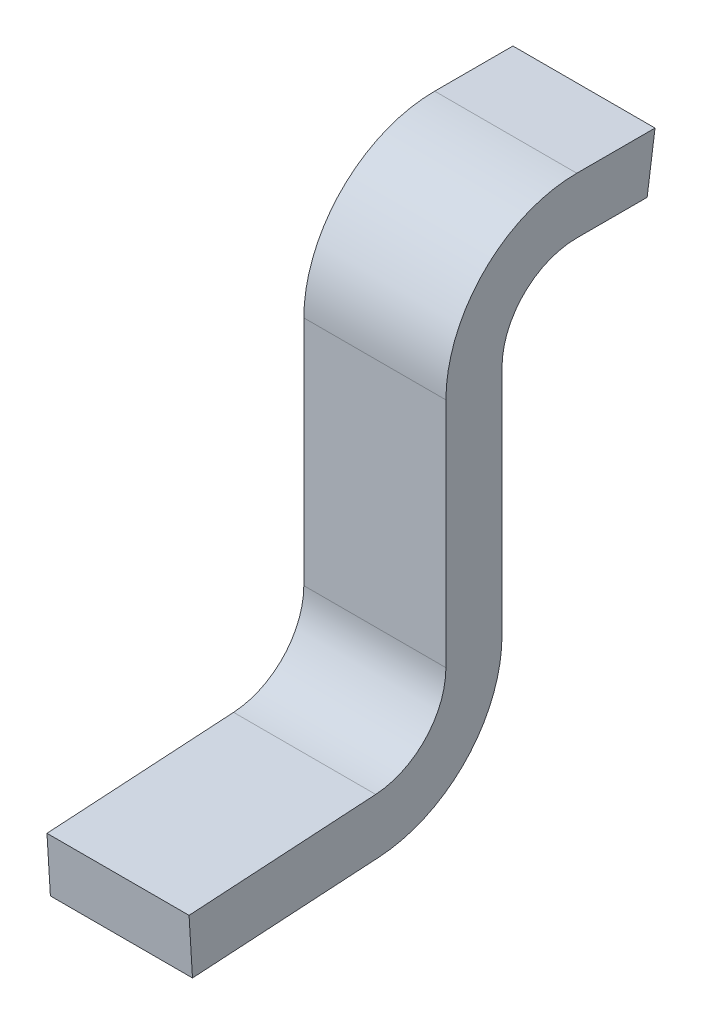
ISO-10303-21;
HEADER;
FILE_DESCRIPTION(('STEP AP214'),'2;1');
FILE_NAME('part.step','',(''),(''),'','','');
FILE_SCHEMA(('AUTOMOTIVE_DESIGN { 1 0 10303 214 1 1 1 1 }'));
ENDSEC;
DATA;
#1=APPLICATION_CONTEXT('core data for automotive mechanical design processes');
#2=APPLICATION_PROTOCOL_DEFINITION('international standard','automotive_design',2000,#1);
#3=PRODUCT_CONTEXT('',#1,'mechanical');
#4=PRODUCT('Part','Part','',(#3));
#5=PRODUCT_RELATED_PRODUCT_CATEGORY('part','',(#4));
#6=PRODUCT_DEFINITION_FORMATION('','',#4);
#7=PRODUCT_DEFINITION_CONTEXT('part definition',#1,'design');
#8=PRODUCT_DEFINITION('design','',#6,#7);
#9=PRODUCT_DEFINITION_SHAPE('','',#8);
#10=(LENGTH_UNIT() NAMED_UNIT(*) SI_UNIT(.MILLI.,.METRE.));
#11=(NAMED_UNIT(*) PLANE_ANGLE_UNIT() SI_UNIT($,.RADIAN.));
#12=(NAMED_UNIT(*) SI_UNIT($,.STERADIAN.) SOLID_ANGLE_UNIT());
#13=UNCERTAINTY_MEASURE_WITH_UNIT(LENGTH_MEASURE(1.E-05),#10,'distance_accuracy_value','');
#14=(GEOMETRIC_REPRESENTATION_CONTEXT(3) GLOBAL_UNCERTAINTY_ASSIGNED_CONTEXT((#13)) GLOBAL_UNIT_ASSIGNED_CONTEXT((#10,
#11,#12)) REPRESENTATION_CONTEXT('',''));
#15=CARTESIAN_POINT('',(0.,0.,0.));
#16=DIRECTION('',(0.,0.,1.));
#17=DIRECTION('',(1.,0.,0.));
#18=AXIS2_PLACEMENT_3D('',#15,#16,#17);
#19=CARTESIAN_POINT('',(-0.825,1.,2.463142308696));
#20=DIRECTION('',(-1.,0.,0.));
#21=DIRECTION('',(0.,0.,1.));
#22=AXIS2_PLACEMENT_3D('',#19,#20,#21);
#23=PLANE('',#22);
#24=CARTESIAN_POINT('',(-0.825,1.,2.463142308696));
#25=DIRECTION('',(1.,0.,0.));
#26=DIRECTION('',(0.,0.,-1.));
#27=AXIS2_PLACEMENT_3D('',#24,#25,#26);
#28=CIRCLE('',#27,0.35);
#29=CARTESIAN_POINT('',(-0.825,1.35,2.463142308696));
#30=VERTEX_POINT('',#29);
#31=CARTESIAN_POINT('',(-0.825,1.,2.813142308696));
#32=VERTEX_POINT('',#31);
#33=EDGE_CURVE('E150',#30,#32,#28,.T.);
#34=ORIENTED_EDGE('',*,*,#33,.F.);
#35=DIRECTION('',(0.,0.,-1.));
#36=VECTOR('',#35,1.);
#37=CARTESIAN_POINT('',(-0.825,1.35,2.463142308696));
#38=LINE('',#37,#36);
#39=CARTESIAN_POINT('',(-0.825,1.35,2.253918874795));
#40=VERTEX_POINT('',#39);
#41=EDGE_CURVE('E142',#30,#40,#38,.T.);
#42=ORIENTED_EDGE('',*,*,#41,.T.);
#43=DIRECTION('',(0.,-0.990268068741588,0.139173100959942));
#44=VECTOR('',#43,1.);
#45=CARTESIAN_POINT('',(-0.825,1.35,2.253918874795));
#46=LINE('',#45,#44);
#47=CARTESIAN_POINT('',(-0.825,1.20000000000003,2.27500000000033));
#48=VERTEX_POINT('',#47);
#49=EDGE_CURVE('E133',#40,#48,#46,.T.);
#50=ORIENTED_EDGE('',*,*,#49,.T.);
#51=DIRECTION('',(0.,0.,1.));
#52=VECTOR('',#51,1.);
#53=CARTESIAN_POINT('',(-0.825,1.2,2.275));
#54=LINE('',#53,#52);
#55=CARTESIAN_POINT('',(-0.825,1.2,2.463142308696));
#56=VERTEX_POINT('',#55);
#57=EDGE_CURVE('E102',#48,#56,#54,.T.);
#58=ORIENTED_EDGE('',*,*,#57,.T.);
#59=CARTESIAN_POINT('',(-0.825,1.,2.463142308696));
#60=DIRECTION('',(1.,0.,0.));
#61=DIRECTION('',(0.,0.,-1.));
#62=AXIS2_PLACEMENT_3D('',#59,#60,#61);
#63=CIRCLE('',#62,0.2);
#64=CARTESIAN_POINT('',(-0.825,1.,2.663142308696));
#65=VERTEX_POINT('',#64);
#66=EDGE_CURVE('E20',#56,#65,#63,.T.);
#67=ORIENTED_EDGE('',*,*,#66,.T.);
#68=DIRECTION('',(0.,-1.,0.));
#69=VECTOR('',#68,1.);
#70=CARTESIAN_POINT('',(-0.825,1.,2.663142308696));
#71=LINE('',#70,#69);
#72=CARTESIAN_POINT('',(-0.825,0.379871449215,2.663142308696));
#73=VERTEX_POINT('',#72);
#74=EDGE_CURVE('E106',#65,#73,#71,.T.);
#75=ORIENTED_EDGE('',*,*,#74,.T.);
#76=CARTESIAN_POINT('',(-0.825,0.379871449215,3.013142308696));
#77=DIRECTION('',(1.,0.,0.));
#78=DIRECTION('',(0.,0.,-1.));
#79=AXIS2_PLACEMENT_3D('',#76,#77,#78);
#80=CIRCLE('',#79,0.35);
#81=CARTESIAN_POINT('',(-0.825,0.0305242697674257,2.99177531985891));
#82=VERTEX_POINT('',#81);
#83=EDGE_CURVE('E118',#82,#73,#80,.T.);
#84=ORIENTED_EDGE('',*,*,#83,.F.);
#85=DIRECTION('',(0.,-0.0610485395348419,0.998134798421868));
#86=VECTOR('',#85,1.);
#87=CARTESIAN_POINT('',(-0.825,0.03052426976742,2.991775319859));
#88=LINE('',#87,#86);
#89=CARTESIAN_POINT('',(-0.825,0.,3.49084271906986));
#90=VERTEX_POINT('',#89);
#91=EDGE_CURVE('E163',#82,#90,#88,.T.);
#92=ORIENTED_EDGE('',*,*,#91,.T.);
#93=DIRECTION('',(0.,0.998134798421868,0.0610485395348419));
#94=VECTOR('',#93,1.);
#95=CARTESIAN_POINT('',(-0.825,0.149720219763,3.5));
#96=LINE('',#95,#94);
#97=CARTESIAN_POINT('',(-0.825,0.149720219763382,3.50000000000002));
#98=VERTEX_POINT('',#97);
#99=EDGE_CURVE('E158',#90,#98,#96,.T.);
#100=ORIENTED_EDGE('',*,*,#99,.T.);
#101=DIRECTION('',(0.,0.0610485395348419,-0.998134798421868));
#102=VECTOR('',#101,1.);
#103=CARTESIAN_POINT('',(-0.825,0.180244489531,3.000932600789));
#104=LINE('',#103,#102);
#105=CARTESIAN_POINT('',(-0.825,0.180244489530813,3.00093260078902));
#106=VERTEX_POINT('',#105);
#107=EDGE_CURVE('E152',#98,#106,#104,.T.);
#108=ORIENTED_EDGE('',*,*,#107,.T.);
#109=CARTESIAN_POINT('',(-0.825,0.379871449215,3.013142308696));
#110=DIRECTION('',(1.,0.,0.));
#111=DIRECTION('',(0.,0.,-1.));
#112=AXIS2_PLACEMENT_3D('',#109,#110,#111);
#113=CIRCLE('',#112,0.2);
#114=CARTESIAN_POINT('',(-0.825,0.379871449215,2.813142308696));
#115=VERTEX_POINT('',#114);
#116=EDGE_CURVE('E184',#106,#115,#113,.T.);
#117=ORIENTED_EDGE('',*,*,#116,.T.);
#118=DIRECTION('',(0.,1.,0.));
#119=VECTOR('',#118,1.);
#120=CARTESIAN_POINT('',(-0.825,1.,2.813142308696));
#121=LINE('',#120,#119);
#122=EDGE_CURVE('E147',#115,#32,#121,.T.);
#123=ORIENTED_EDGE('',*,*,#122,.T.);
#124=EDGE_LOOP('',(#34,#42,#50,#58,#67,#75,#84,#92,#100,#108,#117,#123));
#125=FACE_BOUND('',#124,.T.);
#126=ADVANCED_FACE('F17',(#125),#23,.T.);
#127=CARTESIAN_POINT('',(-0.825,1.2,2.275));
#128=DIRECTION('',(0.,1.,0.));
#129=DIRECTION('',(0.,0.,1.));
#130=AXIS2_PLACEMENT_3D('',#127,#128,#129);
#131=PLANE('',#130);
#132=DIRECTION('',(1.,0.,0.));
#133=VECTOR('',#132,1.);
#134=CARTESIAN_POINT('',(-0.825,1.2,2.463142308696));
#135=LINE('',#134,#133);
#136=CARTESIAN_POINT('',(-0.445,1.2,2.463142308696));
#137=VERTEX_POINT('',#136);
#138=EDGE_CURVE('E112',#137,#56,#135,.F.);
#139=ORIENTED_EDGE('',*,*,#138,.T.);
#140=ORIENTED_EDGE('',*,*,#57,.F.);
#141=DIRECTION('',(1.,0.,0.));
#142=VECTOR('',#141,1.);
#143=CARTESIAN_POINT('',(-0.825,1.20000000000005,2.27500000000033));
#144=LINE('',#143,#142);
#145=CARTESIAN_POINT('',(-0.445,1.20000000000002,2.27500000000011));
#146=VERTEX_POINT('',#145);
#147=EDGE_CURVE('E129',#48,#146,#144,.T.);
#148=ORIENTED_EDGE('',*,*,#147,.T.);
#149=DIRECTION('',(0.,0.,1.));
#150=VECTOR('',#149,1.);
#151=CARTESIAN_POINT('',(-0.445,1.2,2.463142308696));
#152=LINE('',#151,#150);
#153=EDGE_CURVE('E132',#146,#137,#152,.T.);
#154=ORIENTED_EDGE('',*,*,#153,.T.);
#155=EDGE_LOOP('',(#139,#140,#148,#154));
#156=FACE_BOUND('',#155,.T.);
#157=ADVANCED_FACE('F366',(#156),#131,.F.);
#158=CARTESIAN_POINT('',(-0.825,1.,2.463142308696));
#159=DIRECTION('',(1.,0.,0.));
#160=DIRECTION('',(0.,0.,-1.));
#161=AXIS2_PLACEMENT_3D('',#158,#159,#160);
#162=CYLINDRICAL_SURFACE('',#161,0.2);
#163=DIRECTION('',(1.,0.,0.));
#164=VECTOR('',#163,1.);
#165=CARTESIAN_POINT('',(-0.825,1.,2.663142308696));
#166=LINE('',#165,#164);
#167=CARTESIAN_POINT('',(-0.445,1.,2.663142308696));
#168=VERTEX_POINT('',#167);
#169=EDGE_CURVE('E111',#168,#65,#166,.F.);
#170=ORIENTED_EDGE('',*,*,#169,.T.);
#171=ORIENTED_EDGE('',*,*,#66,.F.);
#172=ORIENTED_EDGE('',*,*,#138,.F.);
#173=CARTESIAN_POINT('',(-0.445,1.,2.463142308696));
#174=DIRECTION('',(1.,0.,0.));
#175=DIRECTION('',(0.,0.,-1.));
#176=AXIS2_PLACEMENT_3D('',#173,#174,#175);
#177=CIRCLE('',#176,0.2);
#178=EDGE_CURVE('E123',#137,#168,#177,.T.);
#179=ORIENTED_EDGE('',*,*,#178,.T.);
#180=EDGE_LOOP('',(#170,#171,#172,#179));
#181=FACE_BOUND('',#180,.T.);
#182=ADVANCED_FACE('F121',(#181),#162,.F.);
#183=CARTESIAN_POINT('',(-0.825,1.,2.663142308696));
#184=DIRECTION('',(0.,0.,1.));
#185=DIRECTION('',(0.,-1.,0.));
#186=AXIS2_PLACEMENT_3D('',#183,#184,#185);
#187=PLANE('',#186);
#188=DIRECTION('',(1.,0.,0.));
#189=VECTOR('',#188,1.);
#190=CARTESIAN_POINT('',(-0.825,0.379871449215,2.663142308696));
#191=LINE('',#190,#189);
#192=CARTESIAN_POINT('',(-0.445,0.379871449215,2.663142308696));
#193=VERTEX_POINT('',#192);
#194=EDGE_CURVE('E117',#73,#193,#191,.T.);
#195=ORIENTED_EDGE('',*,*,#194,.F.);
#196=ORIENTED_EDGE('',*,*,#74,.F.);
#197=ORIENTED_EDGE('',*,*,#169,.F.);
#198=DIRECTION('',(0.,1.,0.));
#199=VECTOR('',#198,1.);
#200=CARTESIAN_POINT('',(-0.445,1.,2.663142308696));
#201=LINE('',#200,#199);
#202=EDGE_CURVE('E180',#168,#193,#201,.F.);
#203=ORIENTED_EDGE('',*,*,#202,.T.);
#204=EDGE_LOOP('',(#195,#196,#197,#203));
#205=FACE_BOUND('',#204,.T.);
#206=ADVANCED_FACE('F114',(#205),#187,.F.);
#207=CARTESIAN_POINT('',(-0.825,0.379871449215,3.013142308696));
#208=DIRECTION('',(1.,0.,0.));
#209=DIRECTION('',(0.,0.,-1.));
#210=AXIS2_PLACEMENT_3D('',#207,#208,#209);
#211=CYLINDRICAL_SURFACE('',#210,0.35);
#212=ORIENTED_EDGE('',*,*,#83,.T.);
#213=ORIENTED_EDGE('',*,*,#194,.T.);
#214=CARTESIAN_POINT('',(-0.445,0.379871449215,3.013142308696));
#215=DIRECTION('',(1.,0.,0.));
#216=DIRECTION('',(0.,0.,-1.));
#217=AXIS2_PLACEMENT_3D('',#214,#215,#216);
#218=CIRCLE('',#217,0.35);
#219=CARTESIAN_POINT('',(-0.445,0.0305242697674309,2.9917753198589));
#220=VERTEX_POINT('',#219);
#221=EDGE_CURVE('E176',#193,#220,#218,.F.);
#222=ORIENTED_EDGE('',*,*,#221,.T.);
#223=DIRECTION('',(1.,0.,0.));
#224=VECTOR('',#223,1.);
#225=CARTESIAN_POINT('',(-0.825,0.03052426976742,2.991775319859));
#226=LINE('',#225,#224);
#227=EDGE_CURVE('E165',#220,#82,#226,.F.);
#228=ORIENTED_EDGE('',*,*,#227,.T.);
#229=EDGE_LOOP('',(#212,#213,#222,#228));
#230=FACE_BOUND('',#229,.T.);
#231=ADVANCED_FACE('F263',(#230),#211,.T.);
#232=CARTESIAN_POINT('',(-0.825,0.03052426976742,2.991775319859));
#233=DIRECTION('',(0.,0.998134798421868,0.0610485395348419));
#234=DIRECTION('',(0.,-0.0610485395348419,0.998134798421868));
#235=AXIS2_PLACEMENT_3D('',#232,#233,#234);
#236=PLANE('',#235);
#237=DIRECTION('',(1.,0.,0.));
#238=VECTOR('',#237,1.);
#239=CARTESIAN_POINT('',(-0.825,0.,3.49084271906979));
#240=LINE('',#239,#238);
#241=CARTESIAN_POINT('',(-0.445,0.,3.49084271906993));
#242=VERTEX_POINT('',#241);
#243=EDGE_CURVE('E160',#242,#90,#240,.F.);
#244=ORIENTED_EDGE('',*,*,#243,.T.);
#245=ORIENTED_EDGE('',*,*,#91,.F.);
#246=ORIENTED_EDGE('',*,*,#227,.F.);
#247=DIRECTION('',(0.,-0.061048539534852,0.998134798421867));
#248=VECTOR('',#247,1.);
#249=CARTESIAN_POINT('',(-0.445,0.0305242697674301,2.991775319859));
#250=LINE('',#249,#248);
#251=EDGE_CURVE('E179',#220,#242,#250,.T.);
#252=ORIENTED_EDGE('',*,*,#251,.T.);
#253=EDGE_LOOP('',(#244,#245,#246,#252));
#254=FACE_BOUND('',#253,.T.);
#255=ADVANCED_FACE('F262',(#254),#236,.F.);
#256=CARTESIAN_POINT('',(-0.825,0.149720219763,3.5));
#257=DIRECTION('',(0.,0.0610485395348419,-0.998134798421868));
#258=DIRECTION('',(0.,0.998134798421868,0.0610485395348419));
#259=AXIS2_PLACEMENT_3D('',#256,#257,#258);
#260=PLANE('',#259);
#261=DIRECTION('',(1.,0.,0.));
#262=VECTOR('',#261,1.);
#263=CARTESIAN_POINT('',(-0.825,0.149720219763573,3.50000000000004));
#264=LINE('',#263,#262);
#265=CARTESIAN_POINT('',(-0.445,0.149720219763191,3.50000000000001));
#266=VERTEX_POINT('',#265);
#267=EDGE_CURVE('E155',#266,#98,#264,.F.);
#268=ORIENTED_EDGE('',*,*,#267,.T.);
#269=ORIENTED_EDGE('',*,*,#99,.F.);
#270=ORIENTED_EDGE('',*,*,#243,.F.);
#271=DIRECTION('',(0.,0.998134798421953,0.0610485395334517));
#272=VECTOR('',#271,1.);
#273=CARTESIAN_POINT('',(-0.445,0.,3.49084271907));
#274=LINE('',#273,#272);
#275=EDGE_CURVE('E195',#242,#266,#274,.T.);
#276=ORIENTED_EDGE('',*,*,#275,.T.);
#277=EDGE_LOOP('',(#268,#269,#270,#276));
#278=FACE_BOUND('',#277,.T.);
#279=ADVANCED_FACE('F258',(#278),#260,.F.);
#280=CARTESIAN_POINT('',(-0.825,0.180244489531,3.000932600789));
#281=DIRECTION('',(0.,-0.998134798421868,-0.0610485395348419));
#282=DIRECTION('',(0.,0.0610485395348419,-0.998134798421868));
#283=AXIS2_PLACEMENT_3D('',#280,#281,#282);
#284=PLANE('',#283);
#285=DIRECTION('',(1.,0.,0.));
#286=VECTOR('',#285,1.);
#287=CARTESIAN_POINT('',(-0.825,0.18024448953063,3.00093260078898));
#288=LINE('',#287,#286);
#289=CARTESIAN_POINT('',(-0.445,0.18024448953082,3.0009326007889));
#290=VERTEX_POINT('',#289);
#291=EDGE_CURVE('E154',#290,#106,#288,.F.);
#292=ORIENTED_EDGE('',*,*,#291,.T.);
#293=ORIENTED_EDGE('',*,*,#107,.F.);
#294=ORIENTED_EDGE('',*,*,#267,.F.);
#295=DIRECTION('',(0.,0.0610485395359877,-0.998134798421798));
#296=VECTOR('',#295,1.);
#297=CARTESIAN_POINT('',(-0.445,0.149720219763,3.5));
#298=LINE('',#297,#296);
#299=EDGE_CURVE('E175',#266,#290,#298,.T.);
#300=ORIENTED_EDGE('',*,*,#299,.T.);
#301=EDGE_LOOP('',(#292,#293,#294,#300));
#302=FACE_BOUND('',#301,.T.);
#303=ADVANCED_FACE('F254',(#302),#284,.F.);
#304=CARTESIAN_POINT('',(-0.825,0.379871449215,3.013142308696));
#305=DIRECTION('',(1.,0.,0.));
#306=DIRECTION('',(0.,0.,-1.));
#307=AXIS2_PLACEMENT_3D('',#304,#305,#306);
#308=CYLINDRICAL_SURFACE('',#307,0.2);
#309=DIRECTION('',(-1.,0.,0.));
#310=VECTOR('',#309,1.);
#311=CARTESIAN_POINT('',(-0.825,0.379871449215,2.813142308696));
#312=LINE('',#311,#310);
#313=CARTESIAN_POINT('',(-0.445,0.379871449215,2.813142308696));
#314=VERTEX_POINT('',#313);
#315=EDGE_CURVE('E151',#314,#115,#312,.T.);
#316=ORIENTED_EDGE('',*,*,#315,.T.);
#317=ORIENTED_EDGE('',*,*,#116,.F.);
#318=ORIENTED_EDGE('',*,*,#291,.F.);
#319=CARTESIAN_POINT('',(-0.445,0.379871449215,3.013142308696));
#320=DIRECTION('',(1.,0.,0.));
#321=DIRECTION('',(0.,0.,-1.));
#322=AXIS2_PLACEMENT_3D('',#319,#320,#321);
#323=CIRCLE('',#322,0.2);
#324=EDGE_CURVE('E172',#290,#314,#323,.T.);
#325=ORIENTED_EDGE('',*,*,#324,.T.);
#326=EDGE_LOOP('',(#316,#317,#318,#325));
#327=FACE_BOUND('',#326,.T.);
#328=ADVANCED_FACE('F250',(#327),#308,.F.);
#329=CARTESIAN_POINT('',(-0.825,1.,2.813142308696));
#330=DIRECTION('',(0.,0.,-1.));
#331=DIRECTION('',(-1.,0.,0.));
#332=AXIS2_PLACEMENT_3D('',#329,#330,#331);
#333=PLANE('',#332);
#334=DIRECTION('',(1.,0.,0.));
#335=VECTOR('',#334,1.);
#336=CARTESIAN_POINT('',(-0.825,1.,2.813142308696));
#337=LINE('',#336,#335);
#338=CARTESIAN_POINT('',(-0.445,1.,2.813142308696));
#339=VERTEX_POINT('',#338);
#340=EDGE_CURVE('E183',#32,#339,#337,.T.);
#341=ORIENTED_EDGE('',*,*,#340,.F.);
#342=ORIENTED_EDGE('',*,*,#122,.F.);
#343=ORIENTED_EDGE('',*,*,#315,.F.);
#344=DIRECTION('',(0.,1.,0.));
#345=VECTOR('',#344,1.);
#346=CARTESIAN_POINT('',(-0.445,1.,2.813142308696));
#347=LINE('',#346,#345);
#348=EDGE_CURVE('E171',#314,#339,#347,.T.);
#349=ORIENTED_EDGE('',*,*,#348,.T.);
#350=EDGE_LOOP('',(#341,#342,#343,#349));
#351=FACE_BOUND('',#350,.T.);
#352=ADVANCED_FACE('F246',(#351),#333,.F.);
#353=CARTESIAN_POINT('',(-0.825,1.,2.463142308696));
#354=DIRECTION('',(1.,0.,0.));
#355=DIRECTION('',(0.,0.,-1.));
#356=AXIS2_PLACEMENT_3D('',#353,#354,#355);
#357=CYLINDRICAL_SURFACE('',#356,0.35);
#358=ORIENTED_EDGE('',*,*,#33,.T.);
#359=ORIENTED_EDGE('',*,*,#340,.T.);
#360=CARTESIAN_POINT('',(-0.445,1.,2.463142308696));
#361=DIRECTION('',(1.,0.,0.));
#362=DIRECTION('',(0.,0.,-1.));
#363=AXIS2_PLACEMENT_3D('',#360,#361,#362);
#364=CIRCLE('',#363,0.35);
#365=CARTESIAN_POINT('',(-0.445,1.35,2.463142308696));
#366=VERTEX_POINT('',#365);
#367=EDGE_CURVE('E168',#339,#366,#364,.F.);
#368=ORIENTED_EDGE('',*,*,#367,.T.);
#369=DIRECTION('',(1.,0.,0.));
#370=VECTOR('',#369,1.);
#371=CARTESIAN_POINT('',(-0.825,1.35,2.463142308696));
#372=LINE('',#371,#370);
#373=EDGE_CURVE('E144',#366,#30,#372,.F.);
#374=ORIENTED_EDGE('',*,*,#373,.T.);
#375=EDGE_LOOP('',(#358,#359,#368,#374));
#376=FACE_BOUND('',#375,.T.);
#377=ADVANCED_FACE('F242',(#376),#357,.T.);
#378=CARTESIAN_POINT('',(-0.825,1.35,2.463142308696));
#379=DIRECTION('',(0.,-1.,0.));
#380=DIRECTION('',(0.,0.,-1.));
#381=AXIS2_PLACEMENT_3D('',#378,#379,#380);
#382=PLANE('',#381);
#383=DIRECTION('',(1.,0.,0.));
#384=VECTOR('',#383,1.);
#385=CARTESIAN_POINT('',(-0.825,1.35,2.253918874795));
#386=LINE('',#385,#384);
#387=CARTESIAN_POINT('',(-0.445,1.35,2.253918874795));
#388=VERTEX_POINT('',#387);
#389=EDGE_CURVE('E34',#388,#40,#386,.F.);
#390=ORIENTED_EDGE('',*,*,#389,.T.);
#391=ORIENTED_EDGE('',*,*,#41,.F.);
#392=ORIENTED_EDGE('',*,*,#373,.F.);
#393=DIRECTION('',(0.,0.,1.));
#394=VECTOR('',#393,1.);
#395=CARTESIAN_POINT('',(-0.445,1.35,2.463142308696));
#396=LINE('',#395,#394);
#397=EDGE_CURVE('E26',#366,#388,#396,.F.);
#398=ORIENTED_EDGE('',*,*,#397,.T.);
#399=EDGE_LOOP('',(#390,#391,#392,#398));
#400=FACE_BOUND('',#399,.T.);
#401=ADVANCED_FACE('F234',(#400),#382,.F.);
#402=CARTESIAN_POINT('',(-0.825,1.35,2.253918874795));
#403=DIRECTION('',(0.,0.139173100959942,0.990268068741588));
#404=DIRECTION('',(0.,-0.990268068741588,0.139173100959942));
#405=AXIS2_PLACEMENT_3D('',#402,#403,#404);
#406=PLANE('',#405);
#407=ORIENTED_EDGE('',*,*,#147,.F.);
#408=ORIENTED_EDGE('',*,*,#49,.F.);
#409=ORIENTED_EDGE('',*,*,#389,.F.);
#410=DIRECTION('',(0.,-0.990268068741897,0.139173100957743));
#411=VECTOR('',#410,1.);
#412=CARTESIAN_POINT('',(-0.445,1.35,2.253918874795));
#413=LINE('',#412,#411);
#414=EDGE_CURVE('E11',#388,#146,#413,.T.);
#415=ORIENTED_EDGE('',*,*,#414,.T.);
#416=EDGE_LOOP('',(#407,#408,#409,#415));
#417=FACE_BOUND('',#416,.T.);
#418=ADVANCED_FACE('F274',(#417),#406,.F.);
#419=CARTESIAN_POINT('',(-0.445,1.,2.463142308696));
#420=DIRECTION('',(-1.,0.,0.));
#421=DIRECTION('',(0.,0.,1.));
#422=AXIS2_PLACEMENT_3D('',#419,#420,#421);
#423=PLANE('',#422);
#424=ORIENTED_EDGE('',*,*,#397,.F.);
#425=ORIENTED_EDGE('',*,*,#367,.F.);
#426=ORIENTED_EDGE('',*,*,#348,.F.);
#427=ORIENTED_EDGE('',*,*,#324,.F.);
#428=ORIENTED_EDGE('',*,*,#299,.F.);
#429=ORIENTED_EDGE('',*,*,#275,.F.);
#430=ORIENTED_EDGE('',*,*,#251,.F.);
#431=ORIENTED_EDGE('',*,*,#221,.F.);
#432=ORIENTED_EDGE('',*,*,#202,.F.);
#433=ORIENTED_EDGE('',*,*,#178,.F.);
#434=ORIENTED_EDGE('',*,*,#153,.F.);
#435=ORIENTED_EDGE('',*,*,#414,.F.);
#436=EDGE_LOOP('',(#424,#425,#426,#427,#428,#429,#430,#431,#432,#433,#434,#435));
#437=FACE_BOUND('',#436,.T.);
#438=ADVANCED_FACE('F238',(#437),#423,.F.);
#439=CLOSED_SHELL('',(#126,#157,#182,#206,#231,#255,#279,#303,#328,#352,#377,#401,#418,#438));
#440=MANIFOLD_SOLID_BREP('B1',#439);
#441=ADVANCED_BREP_SHAPE_REPRESENTATION('',(#18,#440),#14);
#442=SHAPE_DEFINITION_REPRESENTATION(#9,#441);
ENDSEC;
END-ISO-10303-21;
